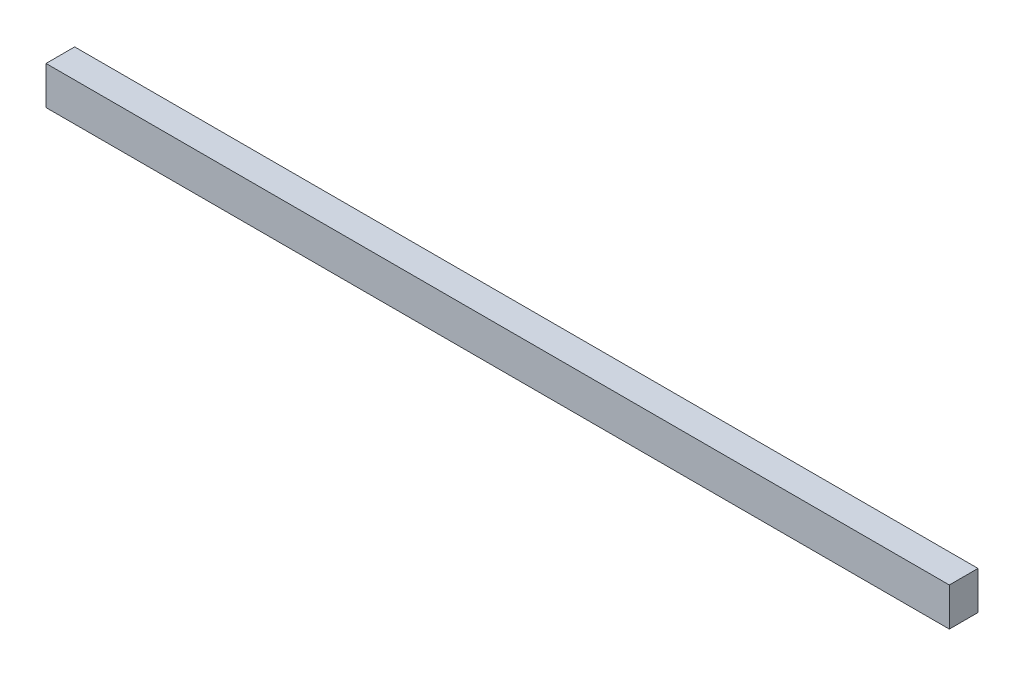
ISO-10303-21;
HEADER;
FILE_DESCRIPTION(('STEP AP214'),'2;1');
FILE_NAME('part.step','',(''),(''),'','','');
FILE_SCHEMA(('AUTOMOTIVE_DESIGN { 1 0 10303 214 1 1 1 1 }'));
ENDSEC;
DATA;
#1=APPLICATION_CONTEXT('core data for automotive mechanical design processes');
#2=APPLICATION_PROTOCOL_DEFINITION('international standard','automotive_design',2000,#1);
#3=PRODUCT_CONTEXT('',#1,'mechanical');
#4=PRODUCT('Part','Part','',(#3));
#5=PRODUCT_RELATED_PRODUCT_CATEGORY('part','',(#4));
#6=PRODUCT_DEFINITION_FORMATION('','',#4);
#7=PRODUCT_DEFINITION_CONTEXT('part definition',#1,'design');
#8=PRODUCT_DEFINITION('design','',#6,#7);
#9=PRODUCT_DEFINITION_SHAPE('','',#8);
#10=(LENGTH_UNIT() NAMED_UNIT(*) SI_UNIT(.MILLI.,.METRE.));
#11=(NAMED_UNIT(*) PLANE_ANGLE_UNIT() SI_UNIT($,.RADIAN.));
#12=(NAMED_UNIT(*) SI_UNIT($,.STERADIAN.) SOLID_ANGLE_UNIT());
#13=UNCERTAINTY_MEASURE_WITH_UNIT(LENGTH_MEASURE(1.E-05),#10,'distance_accuracy_value','');
#14=(GEOMETRIC_REPRESENTATION_CONTEXT(3) GLOBAL_UNCERTAINTY_ASSIGNED_CONTEXT((#13)) GLOBAL_UNIT_ASSIGNED_CONTEXT((#10,
#11,#12)) REPRESENTATION_CONTEXT('',''));
#15=CARTESIAN_POINT('',(0.,0.,0.));
#16=DIRECTION('',(0.,0.,1.));
#17=DIRECTION('',(1.,0.,0.));
#18=AXIS2_PLACEMENT_3D('',#15,#16,#17);
#19=CARTESIAN_POINT('',(1200.15,-50.8000000000001,38.1));
#20=DIRECTION('',(-1.,0.,0.));
#21=DIRECTION('',(0.,0.,1.));
#22=AXIS2_PLACEMENT_3D('',#19,#20,#21);
#23=PLANE('',#22);
#24=DIRECTION('',(0.,1.,0.));
#25=VECTOR('',#24,1.);
#26=CARTESIAN_POINT('',(1200.15,-50.8000000000001,-38.1));
#27=LINE('',#26,#25);
#28=CARTESIAN_POINT('',(1200.15,-50.8000000000001,-38.1));
#29=VERTEX_POINT('',#28);
#30=CARTESIAN_POINT('',(1200.15,50.8000000000001,-38.1));
#31=VERTEX_POINT('',#30);
#32=EDGE_CURVE('E96',#29,#31,#27,.T.);
#33=ORIENTED_EDGE('',*,*,#32,.T.);
#34=DIRECTION('',(0.,0.,-1.));
#35=VECTOR('',#34,1.);
#36=CARTESIAN_POINT('',(1200.15,50.8000000000001,38.1));
#37=LINE('',#36,#35);
#38=CARTESIAN_POINT('',(1200.15,50.8000000000001,38.1));
#39=VERTEX_POINT('',#38);
#40=EDGE_CURVE('E11',#39,#31,#37,.T.);
#41=ORIENTED_EDGE('',*,*,#40,.F.);
#42=DIRECTION('',(0.,1.,0.));
#43=VECTOR('',#42,1.);
#44=CARTESIAN_POINT('',(1200.15,-50.8000000000001,38.1));
#45=LINE('',#44,#43);
#46=CARTESIAN_POINT('',(1200.15,-50.8000000000001,38.1));
#47=VERTEX_POINT('',#46);
#48=EDGE_CURVE('E84',#47,#39,#45,.T.);
#49=ORIENTED_EDGE('',*,*,#48,.F.);
#50=DIRECTION('',(0.,0.,-1.));
#51=VECTOR('',#50,1.);
#52=CARTESIAN_POINT('',(1200.15,-50.8000000000001,38.1));
#53=LINE('',#52,#51);
#54=EDGE_CURVE('E92',#47,#29,#53,.T.);
#55=ORIENTED_EDGE('',*,*,#54,.T.);
#56=EDGE_LOOP('',(#33,#41,#49,#55));
#57=FACE_BOUND('',#56,.T.);
#58=ADVANCED_FACE('F33',(#57),#23,.F.);
#59=CARTESIAN_POINT('',(-1200.15,50.8000000000001,38.1));
#60=DIRECTION('',(0.,-1.,0.));
#61=DIRECTION('',(0.,0.,-1.));
#62=AXIS2_PLACEMENT_3D('',#59,#60,#61);
#63=PLANE('',#62);
#64=DIRECTION('',(-1.,0.,0.));
#65=VECTOR('',#64,1.);
#66=CARTESIAN_POINT('',(-1200.15,50.8000000000001,-38.1));
#67=LINE('',#66,#65);
#68=CARTESIAN_POINT('',(-1200.15,50.8000000000001,-38.1));
#69=VERTEX_POINT('',#68);
#70=EDGE_CURVE('E88',#31,#69,#67,.T.);
#71=ORIENTED_EDGE('',*,*,#70,.T.);
#72=DIRECTION('',(0.,0.,-1.));
#73=VECTOR('',#72,1.);
#74=CARTESIAN_POINT('',(-1200.15,50.8000000000001,38.1));
#75=LINE('',#74,#73);
#76=CARTESIAN_POINT('',(-1200.15,50.8000000000001,38.1));
#77=VERTEX_POINT('',#76);
#78=EDGE_CURVE('E41',#77,#69,#75,.T.);
#79=ORIENTED_EDGE('',*,*,#78,.F.);
#80=DIRECTION('',(-1.,0.,0.));
#81=VECTOR('',#80,1.);
#82=CARTESIAN_POINT('',(-1200.15,50.8000000000001,38.1));
#83=LINE('',#82,#81);
#84=EDGE_CURVE('E79',#39,#77,#83,.T.);
#85=ORIENTED_EDGE('',*,*,#84,.F.);
#86=ORIENTED_EDGE('',*,*,#40,.T.);
#87=EDGE_LOOP('',(#71,#79,#85,#86));
#88=FACE_BOUND('',#87,.T.);
#89=ADVANCED_FACE('F87',(#88),#63,.F.);
#90=CARTESIAN_POINT('',(-1200.15,-50.8000000000001,38.1));
#91=DIRECTION('',(1.,0.,0.));
#92=DIRECTION('',(0.,0.,-1.));
#93=AXIS2_PLACEMENT_3D('',#90,#91,#92);
#94=PLANE('',#93);
#95=DIRECTION('',(0.,-1.,0.));
#96=VECTOR('',#95,1.);
#97=CARTESIAN_POINT('',(-1200.15,-50.8000000000001,-38.1));
#98=LINE('',#97,#96);
#99=CARTESIAN_POINT('',(-1200.15,-50.8000000000001,-38.1));
#100=VERTEX_POINT('',#99);
#101=EDGE_CURVE('E66',#69,#100,#98,.T.);
#102=ORIENTED_EDGE('',*,*,#101,.T.);
#103=DIRECTION('',(0.,0.,-1.));
#104=VECTOR('',#103,1.);
#105=CARTESIAN_POINT('',(-1200.15,-50.8000000000001,38.1));
#106=LINE('',#105,#104);
#107=CARTESIAN_POINT('',(-1200.15,-50.8000000000001,38.1));
#108=VERTEX_POINT('',#107);
#109=EDGE_CURVE('E89',#108,#100,#106,.T.);
#110=ORIENTED_EDGE('',*,*,#109,.F.);
#111=DIRECTION('',(0.,-1.,0.));
#112=VECTOR('',#111,1.);
#113=CARTESIAN_POINT('',(-1200.15,-50.8000000000001,38.1));
#114=LINE('',#113,#112);
#115=EDGE_CURVE('E82',#77,#108,#114,.T.);
#116=ORIENTED_EDGE('',*,*,#115,.F.);
#117=ORIENTED_EDGE('',*,*,#78,.T.);
#118=EDGE_LOOP('',(#102,#110,#116,#117));
#119=FACE_BOUND('',#118,.T.);
#120=ADVANCED_FACE('F90',(#119),#94,.F.);
#121=CARTESIAN_POINT('',(-1200.15,-50.8000000000001,38.1));
#122=DIRECTION('',(0.,1.,0.));
#123=DIRECTION('',(0.,0.,1.));
#124=AXIS2_PLACEMENT_3D('',#121,#122,#123);
#125=PLANE('',#124);
#126=DIRECTION('',(1.,0.,0.));
#127=VECTOR('',#126,1.);
#128=CARTESIAN_POINT('',(-1200.15,-50.8000000000001,-38.1));
#129=LINE('',#128,#127);
#130=EDGE_CURVE('E72',#100,#29,#129,.T.);
#131=ORIENTED_EDGE('',*,*,#130,.T.);
#132=ORIENTED_EDGE('',*,*,#54,.F.);
#133=DIRECTION('',(1.,0.,0.));
#134=VECTOR('',#133,1.);
#135=CARTESIAN_POINT('',(-1200.15,-50.8000000000001,38.1));
#136=LINE('',#135,#134);
#137=EDGE_CURVE('E49',#108,#47,#136,.T.);
#138=ORIENTED_EDGE('',*,*,#137,.F.);
#139=ORIENTED_EDGE('',*,*,#109,.T.);
#140=EDGE_LOOP('',(#131,#132,#138,#139));
#141=FACE_BOUND('',#140,.T.);
#142=ADVANCED_FACE('F103',(#141),#125,.F.);
#143=CARTESIAN_POINT('',(0.,0.,38.1));
#144=DIRECTION('',(0.,0.,-1.));
#145=DIRECTION('',(-1.,0.,0.));
#146=AXIS2_PLACEMENT_3D('',#143,#144,#145);
#147=PLANE('',#146);
#148=ORIENTED_EDGE('',*,*,#48,.T.);
#149=ORIENTED_EDGE('',*,*,#84,.T.);
#150=ORIENTED_EDGE('',*,*,#115,.T.);
#151=ORIENTED_EDGE('',*,*,#137,.T.);
#152=EDGE_LOOP('',(#148,#149,#150,#151));
#153=FACE_BOUND('',#152,.T.);
#154=ADVANCED_FACE('F80',(#153),#147,.F.);
#155=CARTESIAN_POINT('',(0.,0.,-38.1));
#156=DIRECTION('',(0.,0.,-1.));
#157=DIRECTION('',(-1.,0.,0.));
#158=AXIS2_PLACEMENT_3D('',#155,#156,#157);
#159=PLANE('',#158);
#160=ORIENTED_EDGE('',*,*,#32,.F.);
#161=ORIENTED_EDGE('',*,*,#130,.F.);
#162=ORIENTED_EDGE('',*,*,#101,.F.);
#163=ORIENTED_EDGE('',*,*,#70,.F.);
#164=EDGE_LOOP('',(#160,#161,#162,#163));
#165=FACE_BOUND('',#164,.T.);
#166=ADVANCED_FACE('F106',(#165),#159,.T.);
#167=CLOSED_SHELL('',(#58,#89,#120,#142,#154,#166));
#168=MANIFOLD_SOLID_BREP('B2',#167);
#169=ADVANCED_BREP_SHAPE_REPRESENTATION('',(#18,#168),#14);
#170=SHAPE_DEFINITION_REPRESENTATION(#9,#169);
ENDSEC;
END-ISO-10303-21;
